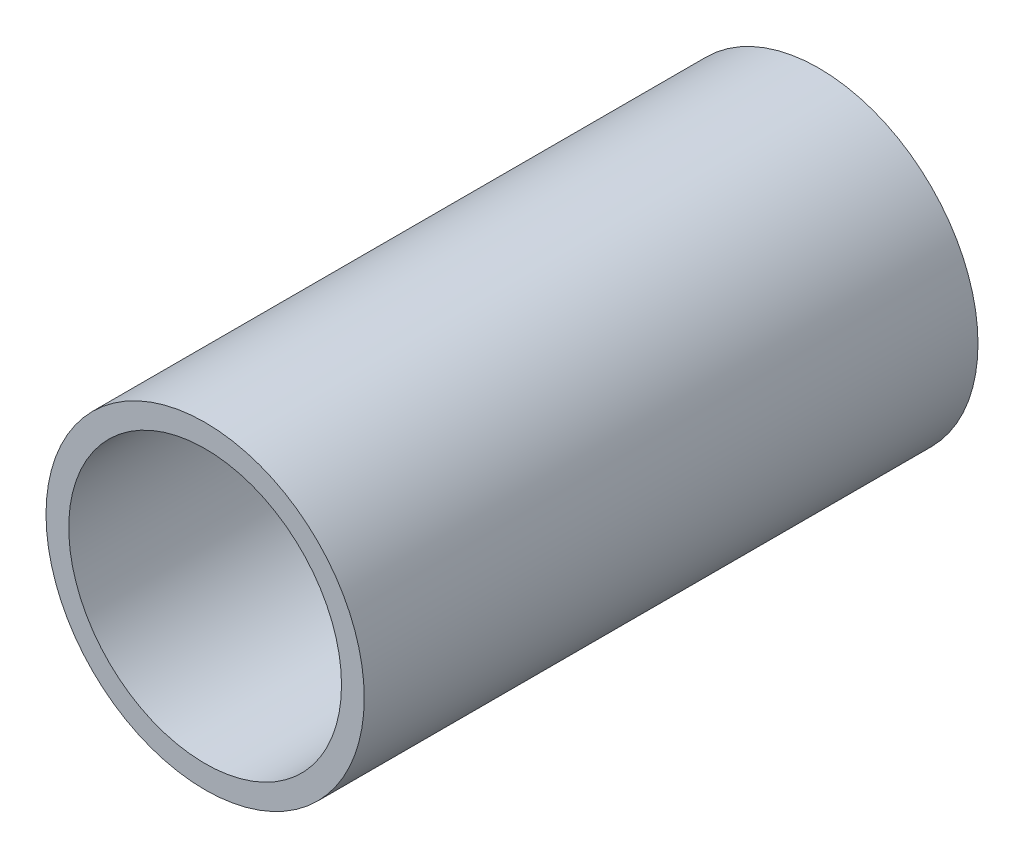
ISO-10303-21;
HEADER;
FILE_DESCRIPTION(('STEP AP214'),'2;1');
FILE_NAME('part.step','',(''),(''),'','','');
FILE_SCHEMA(('AUTOMOTIVE_DESIGN { 1 0 10303 214 1 1 1 1 }'));
ENDSEC;
DATA;
#1=APPLICATION_CONTEXT('core data for automotive mechanical design processes');
#2=APPLICATION_PROTOCOL_DEFINITION('international standard','automotive_design',2000,#1);
#3=PRODUCT_CONTEXT('',#1,'mechanical');
#4=PRODUCT('Part','Part','',(#3));
#5=PRODUCT_RELATED_PRODUCT_CATEGORY('part','',(#4));
#6=PRODUCT_DEFINITION_FORMATION('','',#4);
#7=PRODUCT_DEFINITION_CONTEXT('part definition',#1,'design');
#8=PRODUCT_DEFINITION('design','',#6,#7);
#9=PRODUCT_DEFINITION_SHAPE('','',#8);
#10=(LENGTH_UNIT() NAMED_UNIT(*) SI_UNIT(.MILLI.,.METRE.));
#11=(NAMED_UNIT(*) PLANE_ANGLE_UNIT() SI_UNIT($,.RADIAN.));
#12=(NAMED_UNIT(*) SI_UNIT($,.STERADIAN.) SOLID_ANGLE_UNIT());
#13=UNCERTAINTY_MEASURE_WITH_UNIT(LENGTH_MEASURE(1.E-05),#10,'distance_accuracy_value','');
#14=(GEOMETRIC_REPRESENTATION_CONTEXT(3) GLOBAL_UNCERTAINTY_ASSIGNED_CONTEXT((#13)) GLOBAL_UNIT_ASSIGNED_CONTEXT((#10,
#11,#12)) REPRESENTATION_CONTEXT('',''));
#15=CARTESIAN_POINT('',(0.,0.,0.));
#16=DIRECTION('',(0.,0.,1.));
#17=DIRECTION('',(1.,0.,0.));
#18=AXIS2_PLACEMENT_3D('',#15,#16,#17);
#19=CARTESIAN_POINT('',(0.,0.,85.725));
#20=DIRECTION('',(0.,0.,1.));
#21=DIRECTION('',(1.,0.,0.));
#22=AXIS2_PLACEMENT_3D('',#19,#20,#21);
#23=PLANE('',#22);
#24=CARTESIAN_POINT('',(0.,0.,85.725));
#25=DIRECTION('',(0.,0.,1.));
#26=DIRECTION('',(1.,0.,0.));
#27=AXIS2_PLACEMENT_3D('',#24,#25,#26);
#28=CIRCLE('',#27,22.225);
#29=CARTESIAN_POINT('',(22.225,0.,85.725));
#30=VERTEX_POINT('',#29);
#31=EDGE_CURVE('E10',#30,#30,#28,.T.);
#32=ORIENTED_EDGE('',*,*,#31,.T.);
#33=EDGE_LOOP('',(#32));
#34=FACE_BOUND('',#33,.T.);
#35=CARTESIAN_POINT('',(0.,0.,85.725));
#36=DIRECTION('',(0.,0.,1.));
#37=DIRECTION('',(1.,0.,0.));
#38=AXIS2_PLACEMENT_3D('',#35,#36,#37);
#39=CIRCLE('',#38,19.05);
#40=CARTESIAN_POINT('',(19.05,0.,85.725));
#41=VERTEX_POINT('',#40);
#42=EDGE_CURVE('E46',#41,#41,#39,.T.);
#43=ORIENTED_EDGE('',*,*,#42,.F.);
#44=EDGE_LOOP('',(#43));
#45=FACE_BOUND('',#44,.T.);
#46=ADVANCED_FACE('F35',(#34,#45),#23,.T.);
#47=CARTESIAN_POINT('',(0.,0.,0.));
#48=DIRECTION('',(0.,0.,1.));
#49=DIRECTION('',(1.,0.,0.));
#50=AXIS2_PLACEMENT_3D('',#47,#48,#49);
#51=PLANE('',#50);
#52=CARTESIAN_POINT('',(0.,0.,0.));
#53=DIRECTION('',(0.,0.,1.));
#54=DIRECTION('',(1.,0.,0.));
#55=AXIS2_PLACEMENT_3D('',#52,#53,#54);
#56=CIRCLE('',#55,22.225);
#57=CARTESIAN_POINT('',(22.225,0.,0.));
#58=VERTEX_POINT('',#57);
#59=EDGE_CURVE('E39',#58,#58,#56,.T.);
#60=ORIENTED_EDGE('',*,*,#59,.F.);
#61=EDGE_LOOP('',(#60));
#62=FACE_BOUND('',#61,.T.);
#63=CARTESIAN_POINT('',(0.,0.,0.));
#64=DIRECTION('',(0.,0.,1.));
#65=DIRECTION('',(1.,0.,0.));
#66=AXIS2_PLACEMENT_3D('',#63,#64,#65);
#67=CIRCLE('',#66,19.05);
#68=CARTESIAN_POINT('',(19.05,0.,0.));
#69=VERTEX_POINT('',#68);
#70=EDGE_CURVE('E48',#69,#69,#67,.T.);
#71=ORIENTED_EDGE('',*,*,#70,.T.);
#72=EDGE_LOOP('',(#71));
#73=FACE_BOUND('',#72,.T.);
#74=ADVANCED_FACE('F58',(#62,#73),#51,.F.);
#75=CARTESIAN_POINT('',(0.,0.,85.725));
#76=DIRECTION('',(0.,0.,-1.));
#77=DIRECTION('',(-1.,0.,0.));
#78=AXIS2_PLACEMENT_3D('',#75,#76,#77);
#79=CYLINDRICAL_SURFACE('',#78,22.225);
#80=ORIENTED_EDGE('',*,*,#31,.F.);
#81=EDGE_LOOP('',(#80));
#82=FACE_BOUND('',#81,.T.);
#83=ORIENTED_EDGE('',*,*,#59,.T.);
#84=EDGE_LOOP('',(#83));
#85=FACE_BOUND('',#84,.T.);
#86=ADVANCED_FACE('F37',(#82,#85),#79,.T.);
#87=CARTESIAN_POINT('',(0.,0.,85.725));
#88=DIRECTION('',(0.,0.,-1.));
#89=DIRECTION('',(-1.,0.,0.));
#90=AXIS2_PLACEMENT_3D('',#87,#88,#89);
#91=CYLINDRICAL_SURFACE('',#90,19.05);
#92=ORIENTED_EDGE('',*,*,#42,.T.);
#93=EDGE_LOOP('',(#92));
#94=FACE_BOUND('',#93,.T.);
#95=ORIENTED_EDGE('',*,*,#70,.F.);
#96=EDGE_LOOP('',(#95));
#97=FACE_BOUND('',#96,.T.);
#98=ADVANCED_FACE('F54',(#94,#97),#91,.F.);
#99=CLOSED_SHELL('',(#46,#74,#86,#98));
#100=MANIFOLD_SOLID_BREP('B2',#99);
#101=ADVANCED_BREP_SHAPE_REPRESENTATION('',(#18,#100),#14);
#102=SHAPE_DEFINITION_REPRESENTATION(#9,#101);
ENDSEC;
END-ISO-10303-21;
